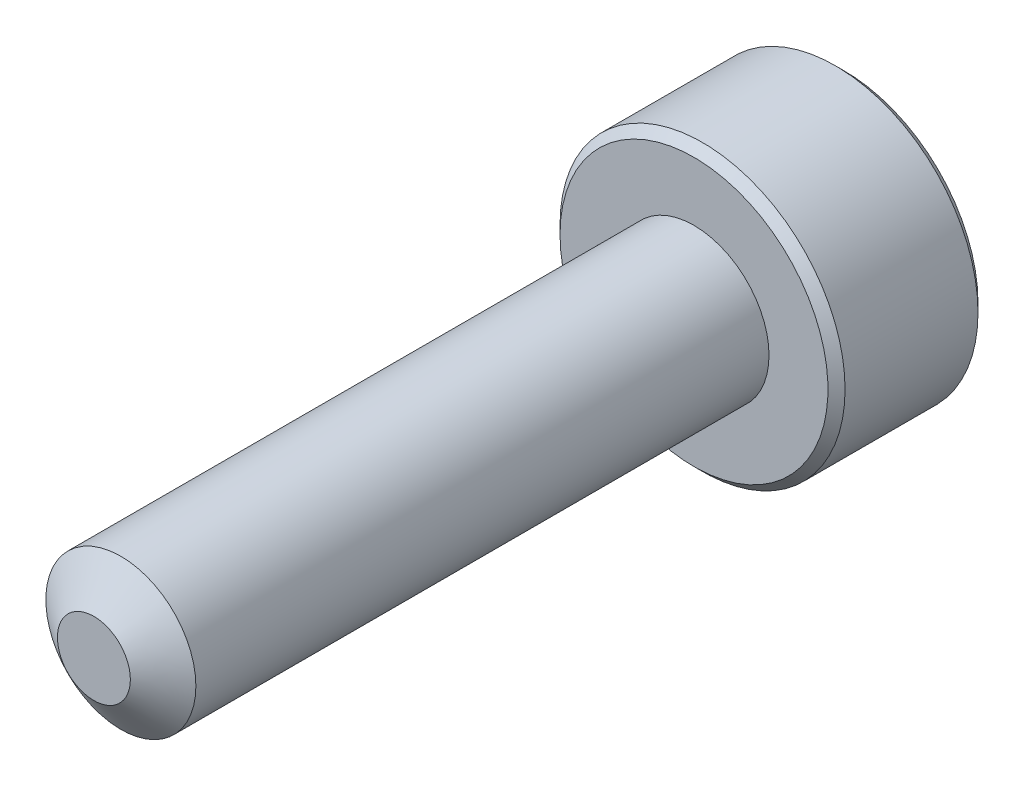
ISO-10303-21;
HEADER;
FILE_DESCRIPTION(('STEP AP214'),'2;1');
FILE_NAME('part.step','',(''),(''),'','','');
FILE_SCHEMA(('AUTOMOTIVE_DESIGN { 1 0 10303 214 1 1 1 1 }'));
ENDSEC;
DATA;
#1=APPLICATION_CONTEXT('core data for automotive mechanical design processes');
#2=APPLICATION_PROTOCOL_DEFINITION('international standard','automotive_design',2000,#1);
#3=PRODUCT_CONTEXT('',#1,'mechanical');
#4=PRODUCT('Part','Part','',(#3));
#5=PRODUCT_RELATED_PRODUCT_CATEGORY('part','',(#4));
#6=PRODUCT_DEFINITION_FORMATION('','',#4);
#7=PRODUCT_DEFINITION_CONTEXT('part definition',#1,'design');
#8=PRODUCT_DEFINITION('design','',#6,#7);
#9=PRODUCT_DEFINITION_SHAPE('','',#8);
#10=(LENGTH_UNIT() NAMED_UNIT(*) SI_UNIT(.MILLI.,.METRE.));
#11=(NAMED_UNIT(*) PLANE_ANGLE_UNIT() SI_UNIT($,.RADIAN.));
#12=(NAMED_UNIT(*) SI_UNIT($,.STERADIAN.) SOLID_ANGLE_UNIT());
#13=UNCERTAINTY_MEASURE_WITH_UNIT(LENGTH_MEASURE(1.E-05),#10,'distance_accuracy_value','');
#14=(GEOMETRIC_REPRESENTATION_CONTEXT(3) GLOBAL_UNCERTAINTY_ASSIGNED_CONTEXT((#13)) GLOBAL_UNIT_ASSIGNED_CONTEXT((#10,
#11,#12)) REPRESENTATION_CONTEXT('',''));
#15=CARTESIAN_POINT('',(0.,0.,0.));
#16=DIRECTION('',(0.,0.,1.));
#17=DIRECTION('',(1.,0.,0.));
#18=AXIS2_PLACEMENT_3D('',#15,#16,#17);
#19=CARTESIAN_POINT('',(0.,0.,-8.));
#20=DIRECTION('',(0.,0.,1.));
#21=DIRECTION('',(1.,0.,0.));
#22=AXIS2_PLACEMENT_3D('',#19,#20,#21);
#23=CYLINDRICAL_SURFACE('',#22,1.);
#24=CARTESIAN_POINT('',(0.,0.,-0.359771969508557));
#25=DIRECTION('',(0.,0.,1.));
#26=DIRECTION('',(1.,0.,0.));
#27=AXIS2_PLACEMENT_3D('',#24,#25,#26);
#28=CIRCLE('',#27,1.);
#29=CARTESIAN_POINT('',(1.,0.,-0.359771969508557));
#30=VERTEX_POINT('',#29);
#31=EDGE_CURVE('E109',#30,#30,#28,.T.);
#32=ORIENTED_EDGE('',*,*,#31,.F.);
#33=EDGE_LOOP('',(#32));
#34=FACE_BOUND('',#33,.T.);
#35=CARTESIAN_POINT('',(0.,0.,-8.));
#36=DIRECTION('',(0.,0.,-1.));
#37=DIRECTION('',(-1.,0.,0.));
#38=AXIS2_PLACEMENT_3D('',#35,#36,#37);
#39=CIRCLE('',#38,1.);
#40=CARTESIAN_POINT('',(-1.,0.,-8.));
#41=VERTEX_POINT('',#40);
#42=EDGE_CURVE('E212',#41,#41,#39,.F.);
#43=ORIENTED_EDGE('',*,*,#42,.T.);
#44=EDGE_LOOP('',(#43));
#45=FACE_BOUND('',#44,.T.);
#46=ADVANCED_FACE('F35',(#34,#45),#23,.T.);
#47=CARTESIAN_POINT('',(0.,0.,0.));
#48=DIRECTION('',(0.,0.,-1.));
#49=DIRECTION('',(-1.,0.,0.));
#50=AXIS2_PLACEMENT_3D('',#47,#48,#49);
#51=CONICAL_SURFACE('',#50,0.486192378864667,0.959931088596884);
#52=ORIENTED_EDGE('',*,*,#31,.T.);
#53=EDGE_LOOP('',(#52));
#54=FACE_BOUND('',#53,.T.);
#55=CARTESIAN_POINT('',(0.,0.,0.));
#56=DIRECTION('',(0.,0.,1.));
#57=DIRECTION('',(1.,0.,0.));
#58=AXIS2_PLACEMENT_3D('',#55,#56,#57);
#59=CIRCLE('',#58,0.486192378864667);
#60=CARTESIAN_POINT('',(0.486192378864667,0.,0.));
#61=VERTEX_POINT('',#60);
#62=EDGE_CURVE('E210',#61,#61,#59,.T.);
#63=ORIENTED_EDGE('',*,*,#62,.F.);
#64=EDGE_LOOP('',(#63));
#65=FACE_BOUND('',#64,.T.);
#66=ADVANCED_FACE('F193',(#54,#65),#51,.T.);
#67=CARTESIAN_POINT('',(0.,0.,0.));
#68=DIRECTION('',(0.,0.,1.));
#69=DIRECTION('',(1.,0.,0.));
#70=AXIS2_PLACEMENT_3D('',#67,#68,#69);
#71=PLANE('',#70);
#72=ORIENTED_EDGE('',*,*,#62,.T.);
#73=EDGE_LOOP('',(#72));
#74=FACE_BOUND('',#73,.T.);
#75=ADVANCED_FACE('F190',(#74),#71,.T.);
#76=CARTESIAN_POINT('',(0.,0.,-10.));
#77=DIRECTION('',(0.,0.,1.));
#78=DIRECTION('',(1.,0.,0.));
#79=AXIS2_PLACEMENT_3D('',#76,#77,#78);
#80=CYLINDRICAL_SURFACE('',#79,1.9);
#81=CARTESIAN_POINT('',(0.,0.,-9.886));
#82=DIRECTION('',(0.,0.,-1.));
#83=DIRECTION('',(-1.,0.,0.));
#84=AXIS2_PLACEMENT_3D('',#81,#82,#83);
#85=CIRCLE('',#84,1.9);
#86=CARTESIAN_POINT('',(1.9,0.,-9.886));
#87=VERTEX_POINT('',#86);
#88=EDGE_CURVE('E43',#87,#87,#85,.F.);
#89=ORIENTED_EDGE('',*,*,#88,.T.);
#90=EDGE_LOOP('',(#89));
#91=FACE_BOUND('',#90,.T.);
#92=CARTESIAN_POINT('',(0.,0.,-8.114));
#93=DIRECTION('',(0.,0.,-1.));
#94=DIRECTION('',(-1.,0.,0.));
#95=AXIS2_PLACEMENT_3D('',#92,#93,#94);
#96=CIRCLE('',#95,1.9);
#97=CARTESIAN_POINT('',(-1.9,0.,-8.114));
#98=VERTEX_POINT('',#97);
#99=EDGE_CURVE('E169',#98,#98,#96,.T.);
#100=ORIENTED_EDGE('',*,*,#99,.T.);
#101=EDGE_LOOP('',(#100));
#102=FACE_BOUND('',#101,.T.);
#103=ADVANCED_FACE('F174',(#91,#102),#80,.T.);
#104=CARTESIAN_POINT('',(0.,0.,-10.));
#105=DIRECTION('',(0.,0.,-1.));
#106=DIRECTION('',(-1.,0.,0.));
#107=AXIS2_PLACEMENT_3D('',#104,#105,#106);
#108=PLANE('',#107);
#109=CARTESIAN_POINT('',(0.,0.,-10.));
#110=DIRECTION('',(0.,0.,-1.));
#111=DIRECTION('',(-1.,0.,0.));
#112=AXIS2_PLACEMENT_3D('',#109,#110,#111);
#113=CIRCLE('',#112,1.786);
#114=CARTESIAN_POINT('',(1.786,0.,-10.));
#115=VERTEX_POINT('',#114);
#116=EDGE_CURVE('E108',#115,#115,#113,.T.);
#117=ORIENTED_EDGE('',*,*,#116,.T.);
#118=EDGE_LOOP('',(#117));
#119=FACE_BOUND('',#118,.T.);
#120=CARTESIAN_POINT('',(0.,0.,-10.));
#121=DIRECTION('',(0.,0.,-1.));
#122=DIRECTION('',(-1.,0.,0.));
#123=AXIS2_PLACEMENT_3D('',#120,#121,#122);
#124=CIRCLE('',#123,0.866025403784439);
#125=CARTESIAN_POINT('',(-0.75,0.433012701892219,-10.));
#126=VERTEX_POINT('',#125);
#127=CARTESIAN_POINT('',(0.,0.866025403784439,-10.));
#128=VERTEX_POINT('',#127);
#129=EDGE_CURVE('E89',#126,#128,#124,.T.);
#130=ORIENTED_EDGE('',*,*,#129,.F.);
#131=CARTESIAN_POINT('',(-0.75,-0.433012701892219,-10.));
#132=VERTEX_POINT('',#131);
#133=EDGE_CURVE('E49',#132,#126,#124,.T.);
#134=ORIENTED_EDGE('',*,*,#133,.F.);
#135=CARTESIAN_POINT('',(0.,-0.866025403784439,-10.));
#136=VERTEX_POINT('',#135);
#137=EDGE_CURVE('E269',#136,#132,#124,.T.);
#138=ORIENTED_EDGE('',*,*,#137,.F.);
#139=CARTESIAN_POINT('',(0.75,-0.433012701892219,-10.));
#140=VERTEX_POINT('',#139);
#141=EDGE_CURVE('E56',#140,#136,#124,.T.);
#142=ORIENTED_EDGE('',*,*,#141,.F.);
#143=CARTESIAN_POINT('',(0.75,0.43301270189222,-10.));
#144=VERTEX_POINT('',#143);
#145=EDGE_CURVE('E130',#144,#140,#124,.T.);
#146=ORIENTED_EDGE('',*,*,#145,.F.);
#147=EDGE_CURVE('E98',#128,#144,#124,.T.);
#148=ORIENTED_EDGE('',*,*,#147,.F.);
#149=EDGE_LOOP('',(#130,#134,#138,#142,#146,#148));
#150=FACE_BOUND('',#149,.T.);
#151=ADVANCED_FACE('F129',(#119,#150),#108,.T.);
#152=CARTESIAN_POINT('',(0.,0.,-8.));
#153=DIRECTION('',(0.,0.,-1.));
#154=DIRECTION('',(-1.,0.,0.));
#155=AXIS2_PLACEMENT_3D('',#152,#153,#154);
#156=PLANE('',#155);
#157=CARTESIAN_POINT('',(0.,0.,-8.));
#158=DIRECTION('',(0.,0.,-1.));
#159=DIRECTION('',(-1.,0.,0.));
#160=AXIS2_PLACEMENT_3D('',#157,#158,#159);
#161=CIRCLE('',#160,1.786);
#162=CARTESIAN_POINT('',(-1.786,0.,-8.));
#163=VERTEX_POINT('',#162);
#164=EDGE_CURVE('E11',#163,#163,#161,.F.);
#165=ORIENTED_EDGE('',*,*,#164,.T.);
#166=EDGE_LOOP('',(#165));
#167=FACE_BOUND('',#166,.T.);
#168=ORIENTED_EDGE('',*,*,#42,.F.);
#169=EDGE_LOOP('',(#168));
#170=FACE_BOUND('',#169,.T.);
#171=ADVANCED_FACE('F183',(#167,#170),#156,.F.);
#172=CARTESIAN_POINT('',(0.,0.,-10.));
#173=DIRECTION('',(0.,0.,-1.));
#174=DIRECTION('',(-1.,0.,0.));
#175=AXIS2_PLACEMENT_3D('',#172,#173,#174);
#176=CONICAL_SURFACE('',#175,0.866025403784439,0.78539816339745);
#177=ORIENTED_EDGE('',*,*,#147,.T.);
#178=CARTESIAN_POINT('',(-0.000200000000000044,0.866140873838277,-10.0001154931448));
#179=CARTESIAN_POINT('',(0.0255899625576815,0.851251032013209,-9.98523411046392));
#180=CARTESIAN_POINT('',(0.0518112021286593,0.836112192288419,-9.97122626560696));
#181=CARTESIAN_POINT('',(0.105279708235706,0.805242135894348,-9.94557752468226));
#182=CARTESIAN_POINT('',(0.132532067460573,0.789507978959819,-9.93395091170567));
#183=CARTESIAN_POINT('',(0.187485350381353,0.757780686272653,-9.91403404577224));
#184=CARTESIAN_POINT('',(0.215172256695509,0.741795643459147,-9.90569369408137));
#185=CARTESIAN_POINT('',(0.271155595130853,0.709473647943368,-9.89284274196143));
#186=CARTESIAN_POINT('',(0.299450314843645,0.693137683900542,-9.88832254058884));
#187=CARTESIAN_POINT('',(0.348210289268843,0.664986099540475,-9.88424583309743));
#188=CARTESIAN_POINT('',(0.368612065655572,0.65320712845165,-9.88364279661408));
#189=CARTESIAN_POINT('',(0.40937613469636,0.629671982217687,-9.88465450601553));
#190=CARTESIAN_POINT('',(0.429738417651455,0.617915812672247,-9.88626974099003));
#191=CARTESIAN_POINT('',(0.490534543086823,0.582815153286451,-9.89433614697304));
#192=CARTESIAN_POINT('',(0.530665854996099,0.559645329552698,-9.90400893582772));
#193=CARTESIAN_POINT('',(0.601110400354026,0.518974152327358,-9.92735631797231));
#194=CARTESIAN_POINT('',(0.631753572009087,0.501282308923485,-9.93980855807225));
#195=CARTESIAN_POINT('',(0.69183934580479,0.466591771248069,-9.96785961023086));
#196=CARTESIAN_POINT('',(0.721285488381591,0.449591032904757,-9.98344818590375));
#197=CARTESIAN_POINT('',(0.7502,0.432897231838382,-10.0001154931448));
#198=B_SPLINE_CURVE_WITH_KNOTS('',3,(#178,#179,#180,#181,#182,#183,#184,#185,#186,#187,#188,
#189,#190,#191,#192,#193,#194,#195,#196,#197),.UNSPECIFIED.,.F.,.F.,(4,2,2,2,2,2,2,2,2,4),(0.,
0.0999419466095602,0.200466857654446,0.299393763705718,0.398071297300231,0.468665775681748,
0.53927582139884,0.680536257244566,0.792918418368075,0.904939568716032),.UNSPECIFIED.);
#199=EDGE_CURVE('E103',#128,#144,#198,.T.);
#200=ORIENTED_EDGE('',*,*,#199,.F.);
#201=EDGE_LOOP('',(#177,#200));
#202=FACE_BOUND('',#201,.T.);
#203=ADVANCED_FACE('F104',(#202),#176,.F.);
#204=ORIENTED_EDGE('',*,*,#145,.T.);
#205=CARTESIAN_POINT('',(0.75,-0.863604064848464,-10.2777892581354));
#206=CARTESIAN_POINT('',(0.75,-0.842575879734334,-10.2619149320084));
#207=CARTESIAN_POINT('',(0.75,-0.821430496291562,-10.246196265183));
#208=CARTESIAN_POINT('',(0.75,-0.77885785741902,-10.2151345206266));
#209=CARTESIAN_POINT('',(0.75,-0.757430533042237,-10.1997915374936));
#210=CARTESIAN_POINT('',(0.75,-0.692340710712936,-10.1542035802937));
#211=CARTESIAN_POINT('',(0.75,-0.648190081053414,-10.1246440917434));
#212=CARTESIAN_POINT('',(0.75,-0.55560718150175,-10.0666155826928));
#213=CARTESIAN_POINT('',(0.75,-0.507074363017996,-10.0383051093658));
#214=CARTESIAN_POINT('',(0.75,-0.407587529772337,-9.98651811176889));
#215=CARTESIAN_POINT('',(0.75,-0.356642419548471,-9.96302529153186));
#216=CARTESIAN_POINT('',(0.75,-0.280165468820771,-9.93428689950068));
#217=CARTESIAN_POINT('',(0.75,-0.255770023930572,-9.92603927481305));
#218=CARTESIAN_POINT('',(0.75,-0.206403277885132,-9.91149717542019));
#219=CARTESIAN_POINT('',(0.75,-0.181431937185907,-9.90520283526912));
#220=CARTESIAN_POINT('',(0.75,-0.106699879404924,-9.8899931738806));
#221=CARTESIAN_POINT('',(0.75,-0.0561907171762172,-9.8843771847129));
#222=CARTESIAN_POINT('',(0.75,0.0430767231749065,-9.88362825645435));
#223=CARTESIAN_POINT('',(0.75,0.0918322434166289,-9.88812345140562));
#224=CARTESIAN_POINT('',(0.75,0.164112195698295,-9.90133730744598));
#225=CARTESIAN_POINT('',(0.75,0.188278676879437,-9.90690144638208));
#226=CARTESIAN_POINT('',(0.75,0.236094480120332,-9.91992316614873));
#227=CARTESIAN_POINT('',(0.75,0.259743845273042,-9.92738058854766));
#228=CARTESIAN_POINT('',(0.75,0.334198278463821,-9.95366646946609));
#229=CARTESIAN_POINT('',(0.75,0.383940060445496,-9.97549033804845));
#230=CARTESIAN_POINT('',(0.75,0.481089225076668,-10.0240118041006));
#231=CARTESIAN_POINT('',(0.75,0.528487417973019,-10.0507269113104));
#232=CARTESIAN_POINT('',(0.75,0.619071540465253,-10.1058428511508));
#233=CARTESIAN_POINT('',(0.75,0.662349745300241,-10.1340939454522));
#234=CARTESIAN_POINT('',(0.75,0.726111623216227,-10.1777671470975));
#235=CARTESIAN_POINT('',(0.75,0.747090419255283,-10.1924788605167));
#236=CARTESIAN_POINT('',(0.75,0.788761341501863,-10.2222913841024));
#237=CARTESIAN_POINT('',(0.75,0.809453544535622,-10.237392086763));
#238=CARTESIAN_POINT('',(0.75,0.830026390097471,-10.2526540893047));
#239=B_SPLINE_CURVE_WITH_KNOTS('',3,(#205,#206,#207,#208,#209,#210,#211,#212,#213,#214,#215,
#216,#217,#218,#219,#220,#221,#222,#223,#224,#225,#226,#227,#228,#229,#230,#231,#232,#233,#234,
#235,#236,#237,#238),.UNSPECIFIED.,.F.,.F.,(4,2,2,2,2,2,2,2,2,2,2,2,2,2,2,2,4),(0.,
0.0790398443124675,0.158099390497595,0.317425208674103,0.485845155681379,0.653685658303958,
0.730869805636067,0.80805926870401,0.959469653380782,1.10540290447489,1.17973203111653,
1.25405493988072,1.41653726506054,1.57961304287543,1.73458511695816,1.81145152932467,
1.88829692115811),.UNSPECIFIED.);
#240=EDGE_CURVE('E97',#144,#140,#239,.F.);
#241=ORIENTED_EDGE('',*,*,#240,.F.);
#242=EDGE_LOOP('',(#204,#241));
#243=FACE_BOUND('',#242,.T.);
#244=ADVANCED_FACE('F275',(#243),#176,.F.);
#245=ORIENTED_EDGE('',*,*,#141,.T.);
#246=CARTESIAN_POINT('',(0.7502,-0.432897231838381,-10.0001154931448));
#247=CARTESIAN_POINT('',(0.724410037442319,-0.447787073663449,-9.98523411046392));
#248=CARTESIAN_POINT('',(0.698188797871341,-0.462925913388239,-9.97122626560696));
#249=CARTESIAN_POINT('',(0.644720291764294,-0.49379596978231,-9.94557752468226));
#250=CARTESIAN_POINT('',(0.617467932539427,-0.509530126716839,-9.93395091170567));
#251=CARTESIAN_POINT('',(0.562514649618647,-0.541257419404005,-9.91403404577224));
#252=CARTESIAN_POINT('',(0.534827743304491,-0.557242462217511,-9.90569369408137));
#253=CARTESIAN_POINT('',(0.478844404869147,-0.589564457733291,-9.89284274196143));
#254=CARTESIAN_POINT('',(0.450549685156355,-0.605900421776116,-9.88832254058884));
#255=CARTESIAN_POINT('',(0.401789710731157,-0.634052006136183,-9.88424583309743));
#256=CARTESIAN_POINT('',(0.381387934344428,-0.645830977225008,-9.88364279661408));
#257=CARTESIAN_POINT('',(0.34062386530364,-0.669366123458971,-9.88465450601553));
#258=CARTESIAN_POINT('',(0.320261582348545,-0.681122293004411,-9.88626974099003));
#259=CARTESIAN_POINT('',(0.259465456913177,-0.716222952390207,-9.89433614697304));
#260=CARTESIAN_POINT('',(0.219334145003901,-0.73939277612396,-9.90400893582772));
#261=CARTESIAN_POINT('',(0.148889599645974,-0.7800639533493,-9.92735631797231));
#262=CARTESIAN_POINT('',(0.118246427990914,-0.797755796753173,-9.93980855807225));
#263=CARTESIAN_POINT('',(0.0581606541952101,-0.83244633442859,-9.96785961023086));
#264=CARTESIAN_POINT('',(0.0287145116184091,-0.849447072771902,-9.98344818590375));
#265=CARTESIAN_POINT('',(-0.000200000000000009,-0.866140873838277,-10.0001154931448));
#266=B_SPLINE_CURVE_WITH_KNOTS('',3,(#246,#247,#248,#249,#250,#251,#252,#253,#254,#255,#256,
#257,#258,#259,#260,#261,#262,#263,#264,#265),.UNSPECIFIED.,.F.,.F.,(4,2,2,2,2,2,2,2,2,4),(0.,
0.0999419466095603,0.200466857654447,0.299393763705718,0.39807129730023,0.468665775681748,
0.539275821398839,0.680536257244566,0.792918418368074,0.904939568716032),.UNSPECIFIED.);
#267=EDGE_CURVE('E139',#140,#136,#266,.T.);
#268=ORIENTED_EDGE('',*,*,#267,.F.);
#269=EDGE_LOOP('',(#245,#268));
#270=FACE_BOUND('',#269,.T.);
#271=ADVANCED_FACE('F272',(#270),#176,.F.);
#272=ORIENTED_EDGE('',*,*,#137,.T.);
#273=CARTESIAN_POINT('',(0.000199999999999965,-0.866140873838277,-10.0001154931448));
#274=CARTESIAN_POINT('',(-0.0255899625576816,-0.851251032013209,-9.98523411046392));
#275=CARTESIAN_POINT('',(-0.0518112021286594,-0.836112192288419,-9.97122626560696));
#276=CARTESIAN_POINT('',(-0.105279708235706,-0.805242135894348,-9.94557752468226));
#277=CARTESIAN_POINT('',(-0.132532067460573,-0.789507978959819,-9.93395091170567));
#278=CARTESIAN_POINT('',(-0.187485350381353,-0.757780686272653,-9.91403404577224));
#279=CARTESIAN_POINT('',(-0.215172256695509,-0.741795643459147,-9.90569369408137));
#280=CARTESIAN_POINT('',(-0.271155595130853,-0.709473647943368,-9.89284274196143));
#281=CARTESIAN_POINT('',(-0.299450314843645,-0.693137683900542,-9.88832254058884));
#282=CARTESIAN_POINT('',(-0.348210289268843,-0.664986099540475,-9.88424583309743));
#283=CARTESIAN_POINT('',(-0.368612065655573,-0.65320712845165,-9.88364279661408));
#284=CARTESIAN_POINT('',(-0.40937613469636,-0.629671982217687,-9.88465450601553));
#285=CARTESIAN_POINT('',(-0.429738417651455,-0.617915812672247,-9.88626974099003));
#286=CARTESIAN_POINT('',(-0.490534543086824,-0.582815153286451,-9.89433614697304));
#287=CARTESIAN_POINT('',(-0.530665854996099,-0.559645329552698,-9.90400893582772));
#288=CARTESIAN_POINT('',(-0.601110400354026,-0.518974152327358,-9.92735631797231));
#289=CARTESIAN_POINT('',(-0.631753572009087,-0.501282308923485,-9.93980855807225));
#290=CARTESIAN_POINT('',(-0.69183934580479,-0.466591771248069,-9.96785961023086));
#291=CARTESIAN_POINT('',(-0.721285488381591,-0.449591032904757,-9.98344818590375));
#292=CARTESIAN_POINT('',(-0.7502,-0.432897231838382,-10.0001154931448));
#293=B_SPLINE_CURVE_WITH_KNOTS('',3,(#273,#274,#275,#276,#277,#278,#279,#280,#281,#282,#283,
#284,#285,#286,#287,#288,#289,#290,#291,#292),.UNSPECIFIED.,.F.,.F.,(4,2,2,2,2,2,2,2,2,4),(0.,
0.0999419466095602,0.200466857654446,0.299393763705718,0.398071297300231,0.468665775681748,
0.53927582139884,0.680536257244567,0.792918418368074,0.904939568716032),.UNSPECIFIED.);
#294=EDGE_CURVE('E247',#136,#132,#293,.T.);
#295=ORIENTED_EDGE('',*,*,#294,.F.);
#296=EDGE_LOOP('',(#272,#295));
#297=FACE_BOUND('',#296,.T.);
#298=ADVANCED_FACE('F271',(#297),#176,.F.);
#299=ORIENTED_EDGE('',*,*,#133,.T.);
#300=CARTESIAN_POINT('',(-0.75,-0.863604064974113,-10.2777892582303));
#301=CARTESIAN_POINT('',(-0.75,-0.842575879856457,-10.2619149320996));
#302=CARTESIAN_POINT('',(-0.75,-0.821430496410148,-10.2461962652706));
#303=CARTESIAN_POINT('',(-0.75,-0.778857857530498,-10.2151345207069));
#304=CARTESIAN_POINT('',(-0.75,-0.757430533150144,-10.1997915375702));
#305=CARTESIAN_POINT('',(-0.75,-0.692340710809911,-10.1542035803594));
#306=CARTESIAN_POINT('',(-0.75,-0.648190081142954,-10.1246440918019));
#307=CARTESIAN_POINT('',(-0.75,-0.555607181575076,-10.0666155827363));
#308=CARTESIAN_POINT('',(-0.75,-0.507074363082499,-10.0383051094017));
#309=CARTESIAN_POINT('',(-0.75,-0.407587529818443,-9.98651811179061));
#310=CARTESIAN_POINT('',(-0.75,-0.356642419585009,-9.96302529154705));
#311=CARTESIAN_POINT('',(-0.75,-0.280165468850111,-9.93428689951103));
#312=CARTESIAN_POINT('',(-0.75,-0.255770023962927,-9.9260392748236));
#313=CARTESIAN_POINT('',(-0.75,-0.206403277923611,-9.91149717543051));
#314=CARTESIAN_POINT('',(-0.75,-0.181431937227496,-9.90520283527902));
#315=CARTESIAN_POINT('',(-0.75,-0.10669987945563,-9.88999317388815));
#316=CARTESIAN_POINT('',(-0.75,-0.0561907172329784,-9.88437718471751));
#317=CARTESIAN_POINT('',(-0.75,0.0430767231074183,-9.88362825645083));
#318=CARTESIAN_POINT('',(-0.75,0.0918322433444367,-9.88812345139703));
#319=CARTESIAN_POINT('',(-0.75,0.164112195619625,-9.90133730742922));
#320=CARTESIAN_POINT('',(-0.75,0.188278676798617,-9.90690144636243));
#321=CARTESIAN_POINT('',(-0.75,0.236094480035413,-9.91992316612325));
#322=CARTESIAN_POINT('',(-0.75,0.259743845186176,-9.92738058851924));
#323=CARTESIAN_POINT('',(-0.75,0.334198278358036,-9.95366646942379));
#324=CARTESIAN_POINT('',(-0.75,0.383940060323693,-9.97549033799338));
#325=CARTESIAN_POINT('',(-0.75,0.481089224924054,-10.0240118040186));
#326=CARTESIAN_POINT('',(-0.75,0.528487417805621,-10.0507269112141));
#327=CARTESIAN_POINT('',(-0.75,0.619071540271277,-10.1058428510274));
#328=CARTESIAN_POINT('',(-0.75,0.662349745094375,-10.134093945316));
#329=CARTESIAN_POINT('',(-0.75,0.72611162299278,-10.1777671469421));
#330=CARTESIAN_POINT('',(-0.75,0.74709041902606,-10.1924788603549));
#331=CARTESIAN_POINT('',(-0.75,0.788761341261125,-10.222291383928));
#332=CARTESIAN_POINT('',(-0.75,0.809453544289147,-10.2373920865822));
#333=CARTESIAN_POINT('',(-0.75,0.830026389845269,-10.2526540891176));
#334=B_SPLINE_CURVE_WITH_KNOTS('',3,(#300,#301,#302,#303,#304,#305,#306,#307,#308,#309,#310,
#311,#312,#313,#314,#315,#316,#317,#318,#319,#320,#321,#322,#323,#324,#325,#326,#327,#328,#329,
#330,#331,#332,#333),.UNSPECIFIED.,.F.,.F.,(4,2,2,2,2,2,2,2,2,2,2,2,2,2,2,2,4),(0.,
0.0790398443275126,0.158099390527686,0.317425208734853,0.485845155776512,0.653685658433149,
0.73086980575654,0.808059268815782,0.959469653475934,1.10540290455479,1.1797320311882,
1.25405493994416,1.41653726506484,1.57961304282019,1.73458511685198,1.81145152919336,
1.88829692100168),.UNSPECIFIED.);
#335=EDGE_CURVE('E119',#132,#126,#334,.T.);
#336=ORIENTED_EDGE('',*,*,#335,.F.);
#337=EDGE_LOOP('',(#299,#336));
#338=FACE_BOUND('',#337,.T.);
#339=ADVANCED_FACE('F284',(#338),#176,.F.);
#340=ORIENTED_EDGE('',*,*,#129,.T.);
#341=CARTESIAN_POINT('',(-0.7502,0.432897231838382,-10.0001154931448));
#342=CARTESIAN_POINT('',(-0.724410037442318,0.447787073663449,-9.98523411046392));
#343=CARTESIAN_POINT('',(-0.698188797871341,0.462925913388239,-9.97122626560696));
#344=CARTESIAN_POINT('',(-0.644720291764294,0.49379596978231,-9.94557752468226));
#345=CARTESIAN_POINT('',(-0.617467932539428,0.509530126716839,-9.93395091170567));
#346=CARTESIAN_POINT('',(-0.562514649618647,0.541257419404005,-9.91403404577224));
#347=CARTESIAN_POINT('',(-0.534827743304491,0.557242462217511,-9.90569369408137));
#348=CARTESIAN_POINT('',(-0.478844404869147,0.589564457733291,-9.89284274196143));
#349=CARTESIAN_POINT('',(-0.450549685156355,0.605900421776116,-9.88832254058884));
#350=CARTESIAN_POINT('',(-0.401789710731157,0.634052006136183,-9.88424583309743));
#351=CARTESIAN_POINT('',(-0.381387934344428,0.645830977225008,-9.88364279661408));
#352=CARTESIAN_POINT('',(-0.34062386530364,0.669366123458971,-9.88465450601553));
#353=CARTESIAN_POINT('',(-0.320261582348545,0.681122293004411,-9.88626974099003));
#354=CARTESIAN_POINT('',(-0.259465456913177,0.716222952390207,-9.89433614697304));
#355=CARTESIAN_POINT('',(-0.219334145003901,0.73939277612396,-9.90400893582772));
#356=CARTESIAN_POINT('',(-0.148889599645974,0.7800639533493,-9.92735631797231));
#357=CARTESIAN_POINT('',(-0.118246427990913,0.797755796753173,-9.93980855807225));
#358=CARTESIAN_POINT('',(-0.05816065419521,0.83244633442859,-9.96785961023086));
#359=CARTESIAN_POINT('',(-0.0287145116184091,0.849447072771902,-9.98344818590375));
#360=CARTESIAN_POINT('',(0.000200000000000047,0.866140873838277,-10.0001154931448));
#361=B_SPLINE_CURVE_WITH_KNOTS('',3,(#341,#342,#343,#344,#345,#346,#347,#348,#349,#350,#351,
#352,#353,#354,#355,#356,#357,#358,#359,#360),.UNSPECIFIED.,.F.,.F.,(4,2,2,2,2,2,2,2,2,4),(0.,
0.0999419466095603,0.200466857654446,0.299393763705717,0.39807129730023,0.468665775681748,
0.539275821398839,0.680536257244566,0.792918418368074,0.904939568716032),.UNSPECIFIED.);
#362=EDGE_CURVE('E93',#126,#128,#361,.T.);
#363=ORIENTED_EDGE('',*,*,#362,.F.);
#364=EDGE_LOOP('',(#340,#363));
#365=FACE_BOUND('',#364,.T.);
#366=ADVANCED_FACE('F91',(#365),#176,.F.);
#367=CARTESIAN_POINT('',(0.75,1.29903810567666,-8.875));
#368=DIRECTION('',(0.,0.,-1.));
#369=DIRECTION('',(-1.,0.,0.));
#370=AXIS2_PLACEMENT_3D('',#367,#368,#369);
#371=PLANE('',#370);
#372=DIRECTION('',(0.866025403784439,0.5,0.));
#373=VECTOR('',#372,1.);
#374=CARTESIAN_POINT('',(-0.75,0.43301270189222,-8.875));
#375=LINE('',#374,#373);
#376=CARTESIAN_POINT('',(-0.75,0.43301270189222,-8.875));
#377=VERTEX_POINT('',#376);
#378=CARTESIAN_POINT('',(0.,0.866025403784439,-8.875));
#379=VERTEX_POINT('',#378);
#380=EDGE_CURVE('E118',#377,#379,#375,.T.);
#381=ORIENTED_EDGE('',*,*,#380,.T.);
#382=DIRECTION('',(0.866025403784439,-0.5,0.));
#383=VECTOR('',#382,1.);
#384=CARTESIAN_POINT('',(0.,0.866025403784439,-8.875));
#385=LINE('',#384,#383);
#386=CARTESIAN_POINT('',(0.75,0.433012701892219,-8.875));
#387=VERTEX_POINT('',#386);
#388=EDGE_CURVE('E123',#379,#387,#385,.T.);
#389=ORIENTED_EDGE('',*,*,#388,.T.);
#390=DIRECTION('',(0.,-1.,0.));
#391=VECTOR('',#390,1.);
#392=CARTESIAN_POINT('',(0.75,0.433012701892219,-8.875));
#393=LINE('',#392,#391);
#394=CARTESIAN_POINT('',(0.75,-0.433012701892219,-8.875));
#395=VERTEX_POINT('',#394);
#396=EDGE_CURVE('E235',#387,#395,#393,.T.);
#397=ORIENTED_EDGE('',*,*,#396,.T.);
#398=DIRECTION('',(-0.866025403784439,-0.5,0.));
#399=VECTOR('',#398,1.);
#400=CARTESIAN_POINT('',(0.75,-0.433012701892219,-8.875));
#401=LINE('',#400,#399);
#402=CARTESIAN_POINT('',(0.,-0.866025403784439,-8.875));
#403=VERTEX_POINT('',#402);
#404=EDGE_CURVE('E232',#395,#403,#401,.T.);
#405=ORIENTED_EDGE('',*,*,#404,.T.);
#406=DIRECTION('',(-0.866025403784439,0.5,0.));
#407=VECTOR('',#406,1.);
#408=CARTESIAN_POINT('',(0.,-0.866025403784439,-8.875));
#409=LINE('',#408,#407);
#410=CARTESIAN_POINT('',(-0.75,-0.433012701892219,-8.875));
#411=VERTEX_POINT('',#410);
#412=EDGE_CURVE('E229',#403,#411,#409,.T.);
#413=ORIENTED_EDGE('',*,*,#412,.T.);
#414=DIRECTION('',(0.,1.,0.));
#415=VECTOR('',#414,1.);
#416=CARTESIAN_POINT('',(-0.75,-0.433012701892219,-8.875));
#417=LINE('',#416,#415);
#418=EDGE_CURVE('E126',#411,#377,#417,.T.);
#419=ORIENTED_EDGE('',*,*,#418,.T.);
#420=EDGE_LOOP('',(#381,#389,#397,#405,#413,#419));
#421=FACE_BOUND('',#420,.T.);
#422=ADVANCED_FACE('F158',(#421),#371,.T.);
#423=CARTESIAN_POINT('',(0.,0.866025403784439,-8.875));
#424=DIRECTION('',(0.5,0.866025403784439,0.));
#425=DIRECTION('',(-0.866025403784439,0.5,0.));
#426=AXIS2_PLACEMENT_3D('',#423,#424,#425);
#427=PLANE('',#426);
#428=DIRECTION('',(0.,0.,-1.));
#429=VECTOR('',#428,1.);
#430=CARTESIAN_POINT('',(0.,0.866025403784439,-8.875));
#431=LINE('',#430,#429);
#432=EDGE_CURVE('E115',#379,#128,#431,.T.);
#433=ORIENTED_EDGE('',*,*,#432,.T.);
#434=ORIENTED_EDGE('',*,*,#199,.T.);
#435=DIRECTION('',(0.,0.,-1.));
#436=VECTOR('',#435,1.);
#437=CARTESIAN_POINT('',(0.75,0.433012701892219,-8.875));
#438=LINE('',#437,#436);
#439=EDGE_CURVE('E125',#387,#144,#438,.T.);
#440=ORIENTED_EDGE('',*,*,#439,.F.);
#441=ORIENTED_EDGE('',*,*,#388,.F.);
#442=EDGE_LOOP('',(#433,#434,#440,#441));
#443=FACE_BOUND('',#442,.T.);
#444=ADVANCED_FACE('F121',(#443),#427,.F.);
#445=CARTESIAN_POINT('',(0.75,0.433012701892219,-8.875));
#446=DIRECTION('',(1.,0.,0.));
#447=DIRECTION('',(0.,0.,-1.));
#448=AXIS2_PLACEMENT_3D('',#445,#446,#447);
#449=PLANE('',#448);
#450=ORIENTED_EDGE('',*,*,#439,.T.);
#451=ORIENTED_EDGE('',*,*,#240,.T.);
#452=DIRECTION('',(0.,0.,-1.));
#453=VECTOR('',#452,1.);
#454=CARTESIAN_POINT('',(0.75,-0.433012701892219,-8.875));
#455=LINE('',#454,#453);
#456=EDGE_CURVE('E218',#395,#140,#455,.T.);
#457=ORIENTED_EDGE('',*,*,#456,.F.);
#458=ORIENTED_EDGE('',*,*,#396,.F.);
#459=EDGE_LOOP('',(#450,#451,#457,#458));
#460=FACE_BOUND('',#459,.T.);
#461=ADVANCED_FACE('F147',(#460),#449,.F.);
#462=CARTESIAN_POINT('',(0.75,-0.433012701892219,-8.875));
#463=DIRECTION('',(0.5,-0.866025403784439,0.));
#464=DIRECTION('',(0.866025403784439,0.5,0.));
#465=AXIS2_PLACEMENT_3D('',#462,#463,#464);
#466=PLANE('',#465);
#467=ORIENTED_EDGE('',*,*,#456,.T.);
#468=ORIENTED_EDGE('',*,*,#267,.T.);
#469=DIRECTION('',(0.,0.,-1.));
#470=VECTOR('',#469,1.);
#471=CARTESIAN_POINT('',(0.,-0.866025403784439,-8.875));
#472=LINE('',#471,#470);
#473=EDGE_CURVE('E221',#403,#136,#472,.T.);
#474=ORIENTED_EDGE('',*,*,#473,.F.);
#475=ORIENTED_EDGE('',*,*,#404,.F.);
#476=EDGE_LOOP('',(#467,#468,#474,#475));
#477=FACE_BOUND('',#476,.T.);
#478=ADVANCED_FACE('F151',(#477),#466,.F.);
#479=CARTESIAN_POINT('',(0.,-0.866025403784439,-8.875));
#480=DIRECTION('',(-0.5,-0.866025403784439,0.));
#481=DIRECTION('',(0.866025403784439,-0.5,0.));
#482=AXIS2_PLACEMENT_3D('',#479,#480,#481);
#483=PLANE('',#482);
#484=ORIENTED_EDGE('',*,*,#473,.T.);
#485=ORIENTED_EDGE('',*,*,#294,.T.);
#486=DIRECTION('',(0.,0.,-1.));
#487=VECTOR('',#486,1.);
#488=CARTESIAN_POINT('',(-0.75,-0.433012701892219,-8.875));
#489=LINE('',#488,#487);
#490=EDGE_CURVE('E224',#411,#132,#489,.T.);
#491=ORIENTED_EDGE('',*,*,#490,.F.);
#492=ORIENTED_EDGE('',*,*,#412,.F.);
#493=EDGE_LOOP('',(#484,#485,#491,#492));
#494=FACE_BOUND('',#493,.T.);
#495=ADVANCED_FACE('F254',(#494),#483,.F.);
#496=CARTESIAN_POINT('',(-0.75,-0.433012701892219,-8.875));
#497=DIRECTION('',(-1.,0.,0.));
#498=DIRECTION('',(0.,-1.,0.));
#499=AXIS2_PLACEMENT_3D('',#496,#497,#498);
#500=PLANE('',#499);
#501=ORIENTED_EDGE('',*,*,#490,.T.);
#502=ORIENTED_EDGE('',*,*,#335,.T.);
#503=DIRECTION('',(0.,0.,-1.));
#504=VECTOR('',#503,1.);
#505=CARTESIAN_POINT('',(-0.75,0.43301270189222,-8.875));
#506=LINE('',#505,#504);
#507=EDGE_CURVE('E117',#377,#126,#506,.T.);
#508=ORIENTED_EDGE('',*,*,#507,.F.);
#509=ORIENTED_EDGE('',*,*,#418,.F.);
#510=EDGE_LOOP('',(#501,#502,#508,#509));
#511=FACE_BOUND('',#510,.T.);
#512=ADVANCED_FACE('F251',(#511),#500,.F.);
#513=CARTESIAN_POINT('',(-0.75,0.43301270189222,-8.875));
#514=DIRECTION('',(-0.5,0.866025403784439,0.));
#515=DIRECTION('',(-0.866025403784439,-0.5,0.));
#516=AXIS2_PLACEMENT_3D('',#513,#514,#515);
#517=PLANE('',#516);
#518=ORIENTED_EDGE('',*,*,#507,.T.);
#519=ORIENTED_EDGE('',*,*,#362,.T.);
#520=ORIENTED_EDGE('',*,*,#432,.F.);
#521=ORIENTED_EDGE('',*,*,#380,.F.);
#522=EDGE_LOOP('',(#518,#519,#520,#521));
#523=FACE_BOUND('',#522,.T.);
#524=ADVANCED_FACE('F113',(#523),#517,.F.);
#525=CARTESIAN_POINT('',(0.,0.,-10.));
#526=DIRECTION('',(0.,0.,1.));
#527=DIRECTION('',(1.,0.,0.));
#528=AXIS2_PLACEMENT_3D('',#525,#526,#527);
#529=CONICAL_SURFACE('',#528,1.786,0.785398163397445);
#530=CARTESIAN_POINT('',(1.9,0.,-9.886));
#531=CARTESIAN_POINT('',(1.8988125,0.,-9.8871875));
#532=CARTESIAN_POINT('',(1.897625,0.,-9.888375));
#533=CARTESIAN_POINT('',(1.89525,0.,-9.89075));
#534=CARTESIAN_POINT('',(1.8940625,0.,-9.8919375));
#535=CARTESIAN_POINT('',(1.8916875,0.,-9.8943125));
#536=CARTESIAN_POINT('',(1.8905,0.,-9.8955));
#537=CARTESIAN_POINT('',(1.888125,0.,-9.897875));
#538=CARTESIAN_POINT('',(1.8869375,0.,-9.8990625));
#539=CARTESIAN_POINT('',(1.8845625,0.,-9.9014375));
#540=CARTESIAN_POINT('',(1.883375,0.,-9.902625));
#541=CARTESIAN_POINT('',(1.881,0.,-9.905));
#542=CARTESIAN_POINT('',(1.8798125,0.,-9.9061875));
#543=CARTESIAN_POINT('',(1.8774375,0.,-9.9085625));
#544=CARTESIAN_POINT('',(1.87625,0.,-9.90975));
#545=CARTESIAN_POINT('',(1.873875,0.,-9.912125));
#546=CARTESIAN_POINT('',(1.8726875,0.,-9.9133125));
#547=CARTESIAN_POINT('',(1.8703125,0.,-9.9156875));
#548=CARTESIAN_POINT('',(1.869125,0.,-9.916875));
#549=CARTESIAN_POINT('',(1.86675,0.,-9.91925));
#550=CARTESIAN_POINT('',(1.8655625,0.,-9.9204375));
#551=CARTESIAN_POINT('',(1.8631875,0.,-9.9228125));
#552=CARTESIAN_POINT('',(1.862,0.,-9.924));
#553=CARTESIAN_POINT('',(1.859625,0.,-9.926375));
#554=CARTESIAN_POINT('',(1.8584375,0.,-9.9275625));
#555=CARTESIAN_POINT('',(1.8560625,0.,-9.9299375));
#556=CARTESIAN_POINT('',(1.854875,0.,-9.931125));
#557=CARTESIAN_POINT('',(1.8525,0.,-9.9335));
#558=CARTESIAN_POINT('',(1.8513125,0.,-9.9346875));
#559=CARTESIAN_POINT('',(1.8489375,0.,-9.9370625));
#560=CARTESIAN_POINT('',(1.84775,0.,-9.93825));
#561=CARTESIAN_POINT('',(1.845375,0.,-9.940625));
#562=CARTESIAN_POINT('',(1.8441875,0.,-9.9418125));
#563=CARTESIAN_POINT('',(1.8418125,0.,-9.9441875));
#564=CARTESIAN_POINT('',(1.840625,0.,-9.945375));
#565=CARTESIAN_POINT('',(1.83825,0.,-9.94775));
#566=CARTESIAN_POINT('',(1.8370625,0.,-9.9489375));
#567=CARTESIAN_POINT('',(1.8346875,0.,-9.9513125));
#568=CARTESIAN_POINT('',(1.8335,0.,-9.9525));
#569=CARTESIAN_POINT('',(1.831125,0.,-9.954875));
#570=CARTESIAN_POINT('',(1.8299375,0.,-9.9560625));
#571=CARTESIAN_POINT('',(1.8275625,0.,-9.9584375));
#572=CARTESIAN_POINT('',(1.826375,0.,-9.959625));
#573=CARTESIAN_POINT('',(1.824,0.,-9.962));
#574=CARTESIAN_POINT('',(1.8228125,0.,-9.9631875));
#575=CARTESIAN_POINT('',(1.8204375,0.,-9.9655625));
#576=CARTESIAN_POINT('',(1.81925,0.,-9.96675));
#577=CARTESIAN_POINT('',(1.816875,0.,-9.969125));
#578=CARTESIAN_POINT('',(1.8156875,0.,-9.9703125));
#579=CARTESIAN_POINT('',(1.8133125,0.,-9.9726875));
#580=CARTESIAN_POINT('',(1.812125,0.,-9.973875));
#581=CARTESIAN_POINT('',(1.80975,0.,-9.97625));
#582=CARTESIAN_POINT('',(1.8085625,0.,-9.9774375));
#583=CARTESIAN_POINT('',(1.8061875,0.,-9.9798125));
#584=CARTESIAN_POINT('',(1.805,0.,-9.981));
#585=CARTESIAN_POINT('',(1.802625,0.,-9.983375));
#586=CARTESIAN_POINT('',(1.8014375,0.,-9.9845625));
#587=CARTESIAN_POINT('',(1.7990625,0.,-9.9869375));
#588=CARTESIAN_POINT('',(1.797875,0.,-9.988125));
#589=CARTESIAN_POINT('',(1.7955,0.,-9.9905));
#590=CARTESIAN_POINT('',(1.7943125,0.,-9.9916875));
#591=CARTESIAN_POINT('',(1.7919375,0.,-9.9940625));
#592=CARTESIAN_POINT('',(1.79075,0.,-9.99525));
#593=CARTESIAN_POINT('',(1.788375,0.,-9.997625));
#594=CARTESIAN_POINT('',(1.7871875,0.,-9.9988125));
#595=CARTESIAN_POINT('',(1.786,0.,-10.));
#596=B_SPLINE_CURVE_WITH_KNOTS('',3,(#530,#531,#532,#533,#534,#535,#536,#537,#538,#539,#540,
#541,#542,#543,#544,#545,#546,#547,#548,#549,#550,#551,#552,#553,#554,#555,#556,#557,#558,#559,
#560,#561,#562,#563,#564,#565,#566,#567,#568,#569,#570,#571,#572,#573,#574,#575,#576,#577,#578,
#579,#580,#581,#582,#583,#584,#585,#586,#587,#588,#589,#590,#591,#592,#593,#594,#595),
.UNSPECIFIED.,.F.,.F.,(4,2,2,2,2,2,2,2,2,2,2,2,2,2,2,2,2,2,2,2,2,2,2,2,2,2,2,2,2,2,2,2,4),(0.,
0.00503813581595428,0.0100762716319084,0.0151144074478627,0.020152543263817,0.0251906790797711,
0.0302288148957254,0.0352669507116795,0.0403050865276338,0.0453432223435881,0.0503813581595422,
0.0554194939754965,0.0604576297914508,0.0654957656074049,0.0705339014233592,0.0755720372393135,
0.0806101730552676,0.0856483088712219,0.0906864446871762,0.0957245805031303,0.100762716319085,
0.105800852135039,0.110838987950993,0.115877123766947,0.120915259582902,0.125953395398856,
0.13099153121481,0.136029667030764,0.141067802846718,0.146105938662673,0.151144074478627,
0.156182210294581,0.161220346110535),.UNSPECIFIED.);
#597=EDGE_CURVE('BSEAM177',#87,#115,#596,.T.);
#598=ORIENTED_EDGE('',*,*,#88,.F.);
#599=ORIENTED_EDGE('',*,*,#116,.F.);
#600=ORIENTED_EDGE('',*,*,#597,.T.);
#601=ORIENTED_EDGE('',*,*,#597,.F.);
#602=EDGE_LOOP('',(#598,#600,#599,#601));
#603=FACE_BOUND('',#602,.T.);
#604=ADVANCED_FACE('F177',(#603),#529,.T.);
#605=CARTESIAN_POINT('',(0.,0.,-8.114));
#606=DIRECTION('',(0.,0.,-1.));
#607=DIRECTION('',(-1.,0.,0.));
#608=AXIS2_PLACEMENT_3D('',#605,#606,#607);
#609=CONICAL_SURFACE('',#608,1.9,0.785398163397442);
#610=ORIENTED_EDGE('',*,*,#164,.F.);
#611=EDGE_LOOP('',(#610));
#612=FACE_BOUND('',#611,.T.);
#613=ORIENTED_EDGE('',*,*,#99,.F.);
#614=EDGE_LOOP('',(#613));
#615=FACE_BOUND('',#614,.T.);
#616=ADVANCED_FACE('F37',(#612,#615),#609,.T.);
#617=CLOSED_SHELL('',(#46,#66,#75,#103,#151,#171,#203,#244,#271,#298,#339,#366,#422,#444,#461,
#478,#495,#512,#524,#604,#616));
#618=MANIFOLD_SOLID_BREP('B2',#617);
#619=ADVANCED_BREP_SHAPE_REPRESENTATION('',(#18,#618),#14);
#620=SHAPE_DEFINITION_REPRESENTATION(#9,#619);
ENDSEC;
END-ISO-10303-21;
